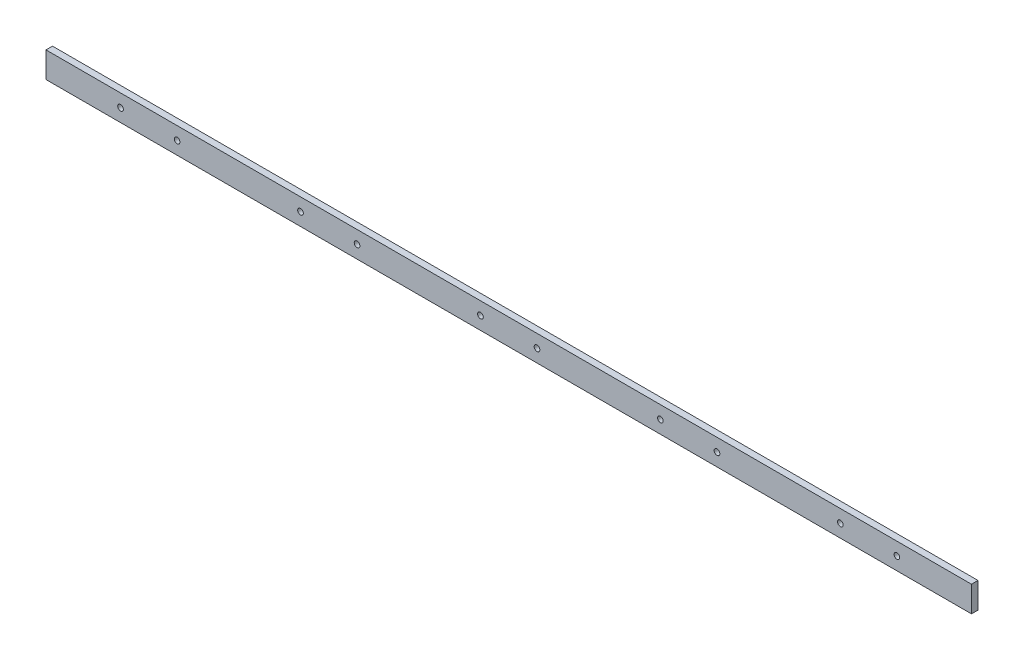
ISO-10303-21;
HEADER;
FILE_DESCRIPTION(('STEP AP214'),'2;1');
FILE_NAME('part.step','',(''),(''),'','','');
FILE_SCHEMA(('AUTOMOTIVE_DESIGN { 1 0 10303 214 1 1 1 1 }'));
ENDSEC;
DATA;
#1=APPLICATION_CONTEXT('core data for automotive mechanical design processes');
#2=APPLICATION_PROTOCOL_DEFINITION('international standard','automotive_design',2000,#1);
#3=PRODUCT_CONTEXT('',#1,'mechanical');
#4=PRODUCT('Part','Part','',(#3));
#5=PRODUCT_RELATED_PRODUCT_CATEGORY('part','',(#4));
#6=PRODUCT_DEFINITION_FORMATION('','',#4);
#7=PRODUCT_DEFINITION_CONTEXT('part definition',#1,'design');
#8=PRODUCT_DEFINITION('design','',#6,#7);
#9=PRODUCT_DEFINITION_SHAPE('','',#8);
#10=(LENGTH_UNIT() NAMED_UNIT(*) SI_UNIT(.MILLI.,.METRE.));
#11=(NAMED_UNIT(*) PLANE_ANGLE_UNIT() SI_UNIT($,.RADIAN.));
#12=(NAMED_UNIT(*) SI_UNIT($,.STERADIAN.) SOLID_ANGLE_UNIT());
#13=UNCERTAINTY_MEASURE_WITH_UNIT(LENGTH_MEASURE(1.E-05),#10,'distance_accuracy_value','');
#14=(GEOMETRIC_REPRESENTATION_CONTEXT(3) GLOBAL_UNCERTAINTY_ASSIGNED_CONTEXT((#13)) GLOBAL_UNIT_ASSIGNED_CONTEXT((#10,
#11,#12)) REPRESENTATION_CONTEXT('',''));
#15=CARTESIAN_POINT('',(0.,0.,0.));
#16=DIRECTION('',(0.,0.,1.));
#17=DIRECTION('',(1.,0.,0.));
#18=AXIS2_PLACEMENT_3D('',#15,#16,#17);
#19=CARTESIAN_POINT('',(0.,0.,6.35));
#20=DIRECTION('',(1.,0.,0.));
#21=DIRECTION('',(0.,0.,-1.));
#22=AXIS2_PLACEMENT_3D('',#19,#20,#21);
#23=PLANE('',#22);
#24=DIRECTION('',(0.,-1.,0.));
#25=VECTOR('',#24,1.);
#26=CARTESIAN_POINT('',(0.,0.,0.));
#27=LINE('',#26,#25);
#28=CARTESIAN_POINT('',(0.,25.,0.));
#29=VERTEX_POINT('',#28);
#30=CARTESIAN_POINT('',(0.,0.,0.));
#31=VERTEX_POINT('',#30);
#32=EDGE_CURVE('E97',#29,#31,#27,.T.);
#33=ORIENTED_EDGE('',*,*,#32,.T.);
#34=DIRECTION('',(0.,0.,-1.));
#35=VECTOR('',#34,1.);
#36=CARTESIAN_POINT('',(0.,0.,6.35));
#37=LINE('',#36,#35);
#38=CARTESIAN_POINT('',(0.,0.,6.35));
#39=VERTEX_POINT('',#38);
#40=EDGE_CURVE('E11',#39,#31,#37,.T.);
#41=ORIENTED_EDGE('',*,*,#40,.F.);
#42=DIRECTION('',(0.,-1.,0.));
#43=VECTOR('',#42,1.);
#44=CARTESIAN_POINT('',(0.,0.,6.35));
#45=LINE('',#44,#43);
#46=CARTESIAN_POINT('',(0.,25.,6.35));
#47=VERTEX_POINT('',#46);
#48=EDGE_CURVE('E85',#47,#39,#45,.T.);
#49=ORIENTED_EDGE('',*,*,#48,.F.);
#50=DIRECTION('',(0.,0.,-1.));
#51=VECTOR('',#50,1.);
#52=CARTESIAN_POINT('',(0.,25.,6.35));
#53=LINE('',#52,#51);
#54=EDGE_CURVE('E93',#47,#29,#53,.T.);
#55=ORIENTED_EDGE('',*,*,#54,.T.);
#56=EDGE_LOOP('',(#33,#41,#49,#55));
#57=FACE_BOUND('',#56,.T.);
#58=ADVANCED_FACE('F34',(#57),#23,.F.);
#59=CARTESIAN_POINT('',(0.,0.,6.35));
#60=DIRECTION('',(0.,1.,0.));
#61=DIRECTION('',(0.,0.,1.));
#62=AXIS2_PLACEMENT_3D('',#59,#60,#61);
#63=PLANE('',#62);
#64=DIRECTION('',(1.,0.,0.));
#65=VECTOR('',#64,1.);
#66=CARTESIAN_POINT('',(0.,0.,0.));
#67=LINE('',#66,#65);
#68=CARTESIAN_POINT('',(900.,0.,0.));
#69=VERTEX_POINT('',#68);
#70=EDGE_CURVE('E89',#31,#69,#67,.T.);
#71=ORIENTED_EDGE('',*,*,#70,.T.);
#72=DIRECTION('',(0.,0.,-1.));
#73=VECTOR('',#72,1.);
#74=CARTESIAN_POINT('',(900.,0.,6.35));
#75=LINE('',#74,#73);
#76=CARTESIAN_POINT('',(900.,0.,6.35));
#77=VERTEX_POINT('',#76);
#78=EDGE_CURVE('E42',#77,#69,#75,.T.);
#79=ORIENTED_EDGE('',*,*,#78,.F.);
#80=DIRECTION('',(1.,0.,0.));
#81=VECTOR('',#80,1.);
#82=CARTESIAN_POINT('',(0.,0.,6.35));
#83=LINE('',#82,#81);
#84=EDGE_CURVE('E80',#39,#77,#83,.T.);
#85=ORIENTED_EDGE('',*,*,#84,.F.);
#86=ORIENTED_EDGE('',*,*,#40,.T.);
#87=EDGE_LOOP('',(#71,#79,#85,#86));
#88=FACE_BOUND('',#87,.T.);
#89=ADVANCED_FACE('F88',(#88),#63,.F.);
#90=CARTESIAN_POINT('',(900.,0.,6.35));
#91=DIRECTION('',(-1.,0.,0.));
#92=DIRECTION('',(0.,0.,1.));
#93=AXIS2_PLACEMENT_3D('',#90,#91,#92);
#94=PLANE('',#93);
#95=DIRECTION('',(0.,1.,0.));
#96=VECTOR('',#95,1.);
#97=CARTESIAN_POINT('',(900.,0.,0.));
#98=LINE('',#97,#96);
#99=CARTESIAN_POINT('',(900.,25.,0.));
#100=VERTEX_POINT('',#99);
#101=EDGE_CURVE('E67',#69,#100,#98,.T.);
#102=ORIENTED_EDGE('',*,*,#101,.T.);
#103=DIRECTION('',(0.,0.,-1.));
#104=VECTOR('',#103,1.);
#105=CARTESIAN_POINT('',(900.,25.,6.35));
#106=LINE('',#105,#104);
#107=CARTESIAN_POINT('',(900.,25.,6.35));
#108=VERTEX_POINT('',#107);
#109=EDGE_CURVE('E90',#108,#100,#106,.T.);
#110=ORIENTED_EDGE('',*,*,#109,.F.);
#111=DIRECTION('',(0.,1.,0.));
#112=VECTOR('',#111,1.);
#113=CARTESIAN_POINT('',(900.,0.,6.35));
#114=LINE('',#113,#112);
#115=EDGE_CURVE('E83',#77,#108,#114,.T.);
#116=ORIENTED_EDGE('',*,*,#115,.F.);
#117=ORIENTED_EDGE('',*,*,#78,.T.);
#118=EDGE_LOOP('',(#102,#110,#116,#117));
#119=FACE_BOUND('',#118,.T.);
#120=ADVANCED_FACE('F91',(#119),#94,.F.);
#121=CARTESIAN_POINT('',(0.,25.,6.35));
#122=DIRECTION('',(0.,-1.,0.));
#123=DIRECTION('',(0.,0.,-1.));
#124=AXIS2_PLACEMENT_3D('',#121,#122,#123);
#125=PLANE('',#124);
#126=DIRECTION('',(-1.,0.,0.));
#127=VECTOR('',#126,1.);
#128=CARTESIAN_POINT('',(0.,25.,0.));
#129=LINE('',#128,#127);
#130=EDGE_CURVE('E73',#100,#29,#129,.T.);
#131=ORIENTED_EDGE('',*,*,#130,.T.);
#132=ORIENTED_EDGE('',*,*,#54,.F.);
#133=DIRECTION('',(-1.,0.,0.));
#134=VECTOR('',#133,1.);
#135=CARTESIAN_POINT('',(0.,25.,6.35));
#136=LINE('',#135,#134);
#137=EDGE_CURVE('E50',#108,#47,#136,.T.);
#138=ORIENTED_EDGE('',*,*,#137,.F.);
#139=ORIENTED_EDGE('',*,*,#109,.T.);
#140=EDGE_LOOP('',(#131,#132,#138,#139));
#141=FACE_BOUND('',#140,.T.);
#142=ADVANCED_FACE('F105',(#141),#125,.F.);
#143=CARTESIAN_POINT('',(0.,0.,6.35));
#144=DIRECTION('',(0.,0.,-1.));
#145=DIRECTION('',(-1.,0.,0.));
#146=AXIS2_PLACEMENT_3D('',#143,#144,#145);
#147=PLANE('',#146);
#148=CARTESIAN_POINT('',(247.5,12.5000000000001,6.35));
#149=DIRECTION('',(0.,0.,1.));
#150=DIRECTION('',(-1.,0.,0.));
#151=AXIS2_PLACEMENT_3D('',#148,#149,#150);
#152=CIRCLE('',#151,2.74999999999993);
#153=CARTESIAN_POINT('',(244.75,12.5000000000001,6.35));
#154=VERTEX_POINT('',#153);
#155=EDGE_CURVE('E144',#154,#154,#152,.T.);
#156=ORIENTED_EDGE('',*,*,#155,.F.);
#157=EDGE_LOOP('',(#156));
#158=FACE_BOUND('',#157,.T.);
#159=CARTESIAN_POINT('',(72.5,12.5000000000001,6.35));
#160=DIRECTION('',(0.,0.,1.));
#161=DIRECTION('',(-1.,0.,0.));
#162=AXIS2_PLACEMENT_3D('',#159,#160,#161);
#163=CIRCLE('',#162,2.75000000000003);
#164=CARTESIAN_POINT('',(69.75,12.5000000000001,6.35));
#165=VERTEX_POINT('',#164);
#166=EDGE_CURVE('E151',#165,#165,#163,.T.);
#167=ORIENTED_EDGE('',*,*,#166,.F.);
#168=EDGE_LOOP('',(#167));
#169=FACE_BOUND('',#168,.T.);
#170=CARTESIAN_POINT('',(827.5,12.5000000000001,6.35));
#171=DIRECTION('',(0.,0.,1.));
#172=DIRECTION('',(1.,0.,0.));
#173=AXIS2_PLACEMENT_3D('',#170,#171,#172);
#174=CIRCLE('',#173,2.75000000000003);
#175=CARTESIAN_POINT('',(830.25,12.5000000000001,6.35));
#176=VERTEX_POINT('',#175);
#177=EDGE_CURVE('E157',#176,#176,#174,.T.);
#178=ORIENTED_EDGE('',*,*,#177,.F.);
#179=EDGE_LOOP('',(#178));
#180=FACE_BOUND('',#179,.T.);
#181=CARTESIAN_POINT('',(772.5,12.5000000000001,6.35));
#182=DIRECTION('',(0.,0.,1.));
#183=DIRECTION('',(1.,0.,0.));
#184=AXIS2_PLACEMENT_3D('',#181,#182,#183);
#185=CIRCLE('',#184,2.74999999999993);
#186=CARTESIAN_POINT('',(775.25,12.5000000000001,6.35));
#187=VERTEX_POINT('',#186);
#188=EDGE_CURVE('E121',#187,#187,#185,.T.);
#189=ORIENTED_EDGE('',*,*,#188,.F.);
#190=EDGE_LOOP('',(#189));
#191=FACE_BOUND('',#190,.T.);
#192=CARTESIAN_POINT('',(652.5,12.5000000000001,6.35));
#193=DIRECTION('',(0.,0.,1.));
#194=DIRECTION('',(1.,0.,0.));
#195=AXIS2_PLACEMENT_3D('',#192,#193,#194);
#196=CIRCLE('',#195,2.74999999999993);
#197=CARTESIAN_POINT('',(655.25,12.5000000000001,6.35));
#198=VERTEX_POINT('',#197);
#199=EDGE_CURVE('E120',#198,#198,#196,.T.);
#200=ORIENTED_EDGE('',*,*,#199,.F.);
#201=EDGE_LOOP('',(#200));
#202=FACE_BOUND('',#201,.T.);
#203=CARTESIAN_POINT('',(597.5,12.5000000000001,6.35));
#204=DIRECTION('',(0.,0.,1.));
#205=DIRECTION('',(1.,0.,0.));
#206=AXIS2_PLACEMENT_3D('',#203,#204,#205);
#207=CIRCLE('',#206,2.75000000000003);
#208=CARTESIAN_POINT('',(600.25,12.5000000000001,6.35));
#209=VERTEX_POINT('',#208);
#210=EDGE_CURVE('E127',#209,#209,#207,.T.);
#211=ORIENTED_EDGE('',*,*,#210,.F.);
#212=EDGE_LOOP('',(#211));
#213=FACE_BOUND('',#212,.T.);
#214=CARTESIAN_POINT('',(127.5,12.5000000000001,6.35));
#215=DIRECTION('',(0.,0.,1.));
#216=DIRECTION('',(-1.,0.,0.));
#217=AXIS2_PLACEMENT_3D('',#214,#215,#216);
#218=CIRCLE('',#217,2.74999999999993);
#219=CARTESIAN_POINT('',(124.75,12.5000000000001,6.35));
#220=VERTEX_POINT('',#219);
#221=EDGE_CURVE('E133',#220,#220,#218,.T.);
#222=ORIENTED_EDGE('',*,*,#221,.F.);
#223=EDGE_LOOP('',(#222));
#224=FACE_BOUND('',#223,.T.);
#225=CARTESIAN_POINT('',(477.5,12.5000000000001,6.35));
#226=DIRECTION('',(0.,0.,1.));
#227=DIRECTION('',(1.,0.,0.));
#228=AXIS2_PLACEMENT_3D('',#225,#226,#227);
#229=CIRCLE('',#228,2.74999999999998);
#230=CARTESIAN_POINT('',(480.25,12.5000000000001,6.35));
#231=VERTEX_POINT('',#230);
#232=EDGE_CURVE('E114',#231,#231,#229,.T.);
#233=ORIENTED_EDGE('',*,*,#232,.F.);
#234=EDGE_LOOP('',(#233));
#235=FACE_BOUND('',#234,.T.);
#236=CARTESIAN_POINT('',(302.5,12.5000000000001,6.35));
#237=DIRECTION('',(0.,0.,1.));
#238=DIRECTION('',(-1.,0.,0.));
#239=AXIS2_PLACEMENT_3D('',#236,#237,#238);
#240=CIRCLE('',#239,2.75000000000003);
#241=CARTESIAN_POINT('',(299.75,12.5000000000001,6.35));
#242=VERTEX_POINT('',#241);
#243=EDGE_CURVE('E145',#242,#242,#240,.T.);
#244=ORIENTED_EDGE('',*,*,#243,.F.);
#245=EDGE_LOOP('',(#244));
#246=FACE_BOUND('',#245,.T.);
#247=CARTESIAN_POINT('',(422.5,12.5000000000001,6.35));
#248=DIRECTION('',(0.,0.,1.));
#249=DIRECTION('',(1.,0.,0.));
#250=AXIS2_PLACEMENT_3D('',#247,#248,#249);
#251=CIRCLE('',#250,2.74999999999998);
#252=CARTESIAN_POINT('',(425.25,12.5000000000001,6.35));
#253=VERTEX_POINT('',#252);
#254=EDGE_CURVE('E100',#253,#253,#251,.T.);
#255=ORIENTED_EDGE('',*,*,#254,.F.);
#256=EDGE_LOOP('',(#255));
#257=FACE_BOUND('',#256,.T.);
#258=ORIENTED_EDGE('',*,*,#48,.T.);
#259=ORIENTED_EDGE('',*,*,#84,.T.);
#260=ORIENTED_EDGE('',*,*,#115,.T.);
#261=ORIENTED_EDGE('',*,*,#137,.T.);
#262=EDGE_LOOP('',(#258,#259,#260,#261));
#263=FACE_BOUND('',#262,.T.);
#264=ADVANCED_FACE('F81',(#158,#169,#180,#191,#202,#213,#224,#235,#246,#257,#263),#147,.F.);
#265=CARTESIAN_POINT('',(0.,0.,0.));
#266=DIRECTION('',(0.,0.,-1.));
#267=DIRECTION('',(-1.,0.,0.));
#268=AXIS2_PLACEMENT_3D('',#265,#266,#267);
#269=PLANE('',#268);
#270=CARTESIAN_POINT('',(247.5,12.5000000000001,0.));
#271=DIRECTION('',(0.,0.,-1.));
#272=DIRECTION('',(-1.,0.,0.));
#273=AXIS2_PLACEMENT_3D('',#270,#271,#272);
#274=CIRCLE('',#273,2.74999999999993);
#275=CARTESIAN_POINT('',(244.75,12.5000000000001,0.));
#276=VERTEX_POINT('',#275);
#277=EDGE_CURVE('E141',#276,#276,#274,.F.);
#278=ORIENTED_EDGE('',*,*,#277,.T.);
#279=EDGE_LOOP('',(#278));
#280=FACE_BOUND('',#279,.T.);
#281=CARTESIAN_POINT('',(72.5,12.5000000000001,0.));
#282=DIRECTION('',(0.,0.,-1.));
#283=DIRECTION('',(-1.,0.,0.));
#284=AXIS2_PLACEMENT_3D('',#281,#282,#283);
#285=CIRCLE('',#284,2.75000000000003);
#286=CARTESIAN_POINT('',(69.75,12.5000000000001,0.));
#287=VERTEX_POINT('',#286);
#288=EDGE_CURVE('E148',#287,#287,#285,.F.);
#289=ORIENTED_EDGE('',*,*,#288,.T.);
#290=EDGE_LOOP('',(#289));
#291=FACE_BOUND('',#290,.T.);
#292=CARTESIAN_POINT('',(827.5,12.5000000000001,0.));
#293=DIRECTION('',(0.,0.,-1.));
#294=DIRECTION('',(-1.,0.,0.));
#295=AXIS2_PLACEMENT_3D('',#292,#293,#294);
#296=CIRCLE('',#295,2.75000000000003);
#297=CARTESIAN_POINT('',(824.75,12.5000000000001,0.));
#298=VERTEX_POINT('',#297);
#299=EDGE_CURVE('E154',#298,#298,#296,.F.);
#300=ORIENTED_EDGE('',*,*,#299,.T.);
#301=EDGE_LOOP('',(#300));
#302=FACE_BOUND('',#301,.T.);
#303=CARTESIAN_POINT('',(772.5,12.5000000000001,0.));
#304=DIRECTION('',(0.,0.,-1.));
#305=DIRECTION('',(-1.,0.,0.));
#306=AXIS2_PLACEMENT_3D('',#303,#304,#305);
#307=CIRCLE('',#306,2.74999999999993);
#308=CARTESIAN_POINT('',(769.75,12.5000000000001,0.));
#309=VERTEX_POINT('',#308);
#310=EDGE_CURVE('E160',#309,#309,#307,.F.);
#311=ORIENTED_EDGE('',*,*,#310,.T.);
#312=EDGE_LOOP('',(#311));
#313=FACE_BOUND('',#312,.T.);
#314=CARTESIAN_POINT('',(652.5,12.5000000000001,0.));
#315=DIRECTION('',(0.,0.,-1.));
#316=DIRECTION('',(-1.,0.,0.));
#317=AXIS2_PLACEMENT_3D('',#314,#315,#316);
#318=CIRCLE('',#317,2.74999999999993);
#319=CARTESIAN_POINT('',(649.75,12.5000000000001,0.));
#320=VERTEX_POINT('',#319);
#321=EDGE_CURVE('E117',#320,#320,#318,.F.);
#322=ORIENTED_EDGE('',*,*,#321,.T.);
#323=EDGE_LOOP('',(#322));
#324=FACE_BOUND('',#323,.T.);
#325=CARTESIAN_POINT('',(597.5,12.5000000000001,0.));
#326=DIRECTION('',(0.,0.,-1.));
#327=DIRECTION('',(-1.,0.,0.));
#328=AXIS2_PLACEMENT_3D('',#325,#326,#327);
#329=CIRCLE('',#328,2.75000000000003);
#330=CARTESIAN_POINT('',(594.75,12.5000000000001,0.));
#331=VERTEX_POINT('',#330);
#332=EDGE_CURVE('E124',#331,#331,#329,.F.);
#333=ORIENTED_EDGE('',*,*,#332,.T.);
#334=EDGE_LOOP('',(#333));
#335=FACE_BOUND('',#334,.T.);
#336=CARTESIAN_POINT('',(127.5,12.5000000000001,0.));
#337=DIRECTION('',(0.,0.,-1.));
#338=DIRECTION('',(-1.,0.,0.));
#339=AXIS2_PLACEMENT_3D('',#336,#337,#338);
#340=CIRCLE('',#339,2.74999999999993);
#341=CARTESIAN_POINT('',(124.75,12.5000000000001,0.));
#342=VERTEX_POINT('',#341);
#343=EDGE_CURVE('E130',#342,#342,#340,.F.);
#344=ORIENTED_EDGE('',*,*,#343,.T.);
#345=EDGE_LOOP('',(#344));
#346=FACE_BOUND('',#345,.T.);
#347=CARTESIAN_POINT('',(477.5,12.5000000000001,0.));
#348=DIRECTION('',(0.,0.,-1.));
#349=DIRECTION('',(-1.,0.,0.));
#350=AXIS2_PLACEMENT_3D('',#347,#348,#349);
#351=CIRCLE('',#350,2.74999999999998);
#352=CARTESIAN_POINT('',(474.75,12.5000000000001,0.));
#353=VERTEX_POINT('',#352);
#354=EDGE_CURVE('E136',#353,#353,#351,.F.);
#355=ORIENTED_EDGE('',*,*,#354,.T.);
#356=EDGE_LOOP('',(#355));
#357=FACE_BOUND('',#356,.T.);
#358=CARTESIAN_POINT('',(302.5,12.5000000000001,0.));
#359=DIRECTION('',(0.,0.,-1.));
#360=DIRECTION('',(-1.,0.,0.));
#361=AXIS2_PLACEMENT_3D('',#358,#359,#360);
#362=CIRCLE('',#361,2.75000000000003);
#363=CARTESIAN_POINT('',(299.75,12.5000000000001,0.));
#364=VERTEX_POINT('',#363);
#365=EDGE_CURVE('E165',#364,#364,#362,.F.);
#366=ORIENTED_EDGE('',*,*,#365,.T.);
#367=EDGE_LOOP('',(#366));
#368=FACE_BOUND('',#367,.T.);
#369=CARTESIAN_POINT('',(422.5,12.5000000000001,0.));
#370=DIRECTION('',(0.,0.,-1.));
#371=DIRECTION('',(-1.,0.,0.));
#372=AXIS2_PLACEMENT_3D('',#369,#370,#371);
#373=CIRCLE('',#372,2.74999999999998);
#374=CARTESIAN_POINT('',(419.75,12.5000000000001,0.));
#375=VERTEX_POINT('',#374);
#376=EDGE_CURVE('E111',#375,#375,#373,.F.);
#377=ORIENTED_EDGE('',*,*,#376,.T.);
#378=EDGE_LOOP('',(#377));
#379=FACE_BOUND('',#378,.T.);
#380=ORIENTED_EDGE('',*,*,#32,.F.);
#381=ORIENTED_EDGE('',*,*,#130,.F.);
#382=ORIENTED_EDGE('',*,*,#101,.F.);
#383=ORIENTED_EDGE('',*,*,#70,.F.);
#384=EDGE_LOOP('',(#380,#381,#382,#383));
#385=FACE_BOUND('',#384,.T.);
#386=ADVANCED_FACE('F108',(#280,#291,#302,#313,#324,#335,#346,#357,#368,#379,#385),#269,.T.);
#387=CARTESIAN_POINT('',(422.5,12.5000000000001,-0.00100000000000013));
#388=DIRECTION('',(0.,0.,1.));
#389=DIRECTION('',(1.,0.,0.));
#390=AXIS2_PLACEMENT_3D('',#387,#388,#389);
#391=CYLINDRICAL_SURFACE('',#390,2.74999999999998);
#392=ORIENTED_EDGE('',*,*,#376,.F.);
#393=EDGE_LOOP('',(#392));
#394=FACE_BOUND('',#393,.T.);
#395=ORIENTED_EDGE('',*,*,#254,.T.);
#396=EDGE_LOOP('',(#395));
#397=FACE_BOUND('',#396,.T.);
#398=ADVANCED_FACE('F179',(#394,#397),#391,.F.);
#399=CARTESIAN_POINT('',(302.5,12.5000000000001,-0.00100000000000013));
#400=DIRECTION('',(0.,0.,1.));
#401=DIRECTION('',(1.,0.,0.));
#402=AXIS2_PLACEMENT_3D('',#399,#400,#401);
#403=CYLINDRICAL_SURFACE('',#402,2.75000000000003);
#404=ORIENTED_EDGE('',*,*,#365,.F.);
#405=EDGE_LOOP('',(#404));
#406=FACE_BOUND('',#405,.T.);
#407=ORIENTED_EDGE('',*,*,#243,.T.);
#408=EDGE_LOOP('',(#407));
#409=FACE_BOUND('',#408,.T.);
#410=ADVANCED_FACE('F171',(#406,#409),#403,.F.);
#411=CARTESIAN_POINT('',(477.5,12.5000000000001,-0.00100000000000013));
#412=DIRECTION('',(0.,0.,1.));
#413=DIRECTION('',(1.,0.,0.));
#414=AXIS2_PLACEMENT_3D('',#411,#412,#413);
#415=CYLINDRICAL_SURFACE('',#414,2.74999999999998);
#416=ORIENTED_EDGE('',*,*,#354,.F.);
#417=EDGE_LOOP('',(#416));
#418=FACE_BOUND('',#417,.T.);
#419=ORIENTED_EDGE('',*,*,#232,.T.);
#420=EDGE_LOOP('',(#419));
#421=FACE_BOUND('',#420,.T.);
#422=ADVANCED_FACE('F187',(#418,#421),#415,.F.);
#423=CARTESIAN_POINT('',(127.5,12.5000000000001,-0.00100000000000013));
#424=DIRECTION('',(0.,0.,1.));
#425=DIRECTION('',(1.,0.,0.));
#426=AXIS2_PLACEMENT_3D('',#423,#424,#425);
#427=CYLINDRICAL_SURFACE('',#426,2.74999999999993);
#428=ORIENTED_EDGE('',*,*,#343,.F.);
#429=EDGE_LOOP('',(#428));
#430=FACE_BOUND('',#429,.T.);
#431=ORIENTED_EDGE('',*,*,#221,.T.);
#432=EDGE_LOOP('',(#431));
#433=FACE_BOUND('',#432,.T.);
#434=ADVANCED_FACE('F235',(#430,#433),#427,.F.);
#435=CARTESIAN_POINT('',(597.5,12.5000000000001,-0.00100000000000013));
#436=DIRECTION('',(0.,0.,1.));
#437=DIRECTION('',(1.,0.,0.));
#438=AXIS2_PLACEMENT_3D('',#435,#436,#437);
#439=CYLINDRICAL_SURFACE('',#438,2.75000000000003);
#440=ORIENTED_EDGE('',*,*,#332,.F.);
#441=EDGE_LOOP('',(#440));
#442=FACE_BOUND('',#441,.T.);
#443=ORIENTED_EDGE('',*,*,#210,.T.);
#444=EDGE_LOOP('',(#443));
#445=FACE_BOUND('',#444,.T.);
#446=ADVANCED_FACE('F245',(#442,#445),#439,.F.);
#447=CARTESIAN_POINT('',(652.5,12.5000000000001,-0.00100000000000013));
#448=DIRECTION('',(0.,0.,1.));
#449=DIRECTION('',(1.,0.,0.));
#450=AXIS2_PLACEMENT_3D('',#447,#448,#449);
#451=CYLINDRICAL_SURFACE('',#450,2.74999999999993);
#452=ORIENTED_EDGE('',*,*,#321,.F.);
#453=EDGE_LOOP('',(#452));
#454=FACE_BOUND('',#453,.T.);
#455=ORIENTED_EDGE('',*,*,#199,.T.);
#456=EDGE_LOOP('',(#455));
#457=FACE_BOUND('',#456,.T.);
#458=ADVANCED_FACE('F255',(#454,#457),#451,.F.);
#459=CARTESIAN_POINT('',(772.5,12.5000000000001,-0.00100000000000013));
#460=DIRECTION('',(0.,0.,1.));
#461=DIRECTION('',(1.,0.,0.));
#462=AXIS2_PLACEMENT_3D('',#459,#460,#461);
#463=CYLINDRICAL_SURFACE('',#462,2.74999999999993);
#464=ORIENTED_EDGE('',*,*,#310,.F.);
#465=EDGE_LOOP('',(#464));
#466=FACE_BOUND('',#465,.T.);
#467=ORIENTED_EDGE('',*,*,#188,.T.);
#468=EDGE_LOOP('',(#467));
#469=FACE_BOUND('',#468,.T.);
#470=ADVANCED_FACE('F265',(#466,#469),#463,.F.);
#471=CARTESIAN_POINT('',(827.5,12.5000000000001,-0.00100000000000013));
#472=DIRECTION('',(0.,0.,1.));
#473=DIRECTION('',(1.,0.,0.));
#474=AXIS2_PLACEMENT_3D('',#471,#472,#473);
#475=CYLINDRICAL_SURFACE('',#474,2.75000000000003);
#476=ORIENTED_EDGE('',*,*,#299,.F.);
#477=EDGE_LOOP('',(#476));
#478=FACE_BOUND('',#477,.T.);
#479=ORIENTED_EDGE('',*,*,#177,.T.);
#480=EDGE_LOOP('',(#479));
#481=FACE_BOUND('',#480,.T.);
#482=ADVANCED_FACE('F274',(#478,#481),#475,.F.);
#483=CARTESIAN_POINT('',(72.5,12.5000000000001,-0.00100000000000013));
#484=DIRECTION('',(0.,0.,1.));
#485=DIRECTION('',(1.,0.,0.));
#486=AXIS2_PLACEMENT_3D('',#483,#484,#485);
#487=CYLINDRICAL_SURFACE('',#486,2.75000000000003);
#488=ORIENTED_EDGE('',*,*,#288,.F.);
#489=EDGE_LOOP('',(#488));
#490=FACE_BOUND('',#489,.T.);
#491=ORIENTED_EDGE('',*,*,#166,.T.);
#492=EDGE_LOOP('',(#491));
#493=FACE_BOUND('',#492,.T.);
#494=ADVANCED_FACE('F284',(#490,#493),#487,.F.);
#495=CARTESIAN_POINT('',(247.5,12.5000000000001,-0.00100000000000013));
#496=DIRECTION('',(0.,0.,1.));
#497=DIRECTION('',(1.,0.,0.));
#498=AXIS2_PLACEMENT_3D('',#495,#496,#497);
#499=CYLINDRICAL_SURFACE('',#498,2.74999999999993);
#500=ORIENTED_EDGE('',*,*,#277,.F.);
#501=EDGE_LOOP('',(#500));
#502=FACE_BOUND('',#501,.T.);
#503=ORIENTED_EDGE('',*,*,#155,.T.);
#504=EDGE_LOOP('',(#503));
#505=FACE_BOUND('',#504,.T.);
#506=ADVANCED_FACE('F294',(#502,#505),#499,.F.);
#507=CLOSED_SHELL('',(#58,#89,#120,#142,#264,#386,#398,#410,#422,#434,#446,#458,#470,#482,#494,#506));
#508=MANIFOLD_SOLID_BREP('B2',#507);
#509=ADVANCED_BREP_SHAPE_REPRESENTATION('',(#18,#508),#14);
#510=SHAPE_DEFINITION_REPRESENTATION(#9,#509);
ENDSEC;
END-ISO-10303-21;
